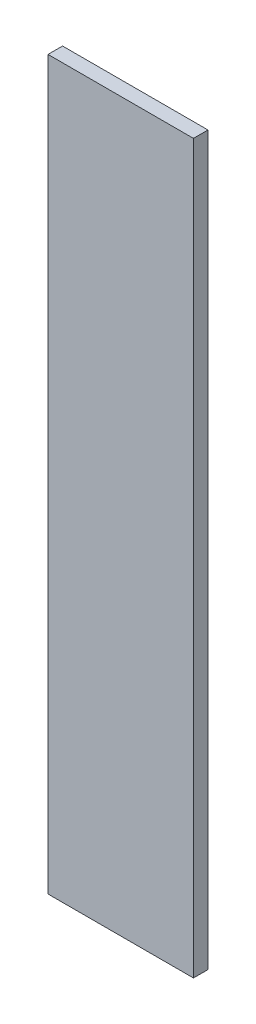
ISO-10303-21;
HEADER;
FILE_DESCRIPTION(('STEP AP214'),'2;1');
FILE_NAME('part.step','',(''),(''),'','','');
FILE_SCHEMA(('AUTOMOTIVE_DESIGN { 1 0 10303 214 1 1 1 1 }'));
ENDSEC;
DATA;
#1=APPLICATION_CONTEXT('core data for automotive mechanical design processes');
#2=APPLICATION_PROTOCOL_DEFINITION('international standard','automotive_design',2000,#1);
#3=PRODUCT_CONTEXT('',#1,'mechanical');
#4=PRODUCT('Part','Part','',(#3));
#5=PRODUCT_RELATED_PRODUCT_CATEGORY('part','',(#4));
#6=PRODUCT_DEFINITION_FORMATION('','',#4);
#7=PRODUCT_DEFINITION_CONTEXT('part definition',#1,'design');
#8=PRODUCT_DEFINITION('design','',#6,#7);
#9=PRODUCT_DEFINITION_SHAPE('','',#8);
#10=(LENGTH_UNIT() NAMED_UNIT(*) SI_UNIT(.MILLI.,.METRE.));
#11=(NAMED_UNIT(*) PLANE_ANGLE_UNIT() SI_UNIT($,.RADIAN.));
#12=(NAMED_UNIT(*) SI_UNIT($,.STERADIAN.) SOLID_ANGLE_UNIT());
#13=UNCERTAINTY_MEASURE_WITH_UNIT(LENGTH_MEASURE(1.E-05),#10,'distance_accuracy_value','');
#14=(GEOMETRIC_REPRESENTATION_CONTEXT(3) GLOBAL_UNCERTAINTY_ASSIGNED_CONTEXT((#13)) GLOBAL_UNIT_ASSIGNED_CONTEXT((#10,
#11,#12)) REPRESENTATION_CONTEXT('',''));
#15=CARTESIAN_POINT('',(0.,0.,0.));
#16=DIRECTION('',(0.,0.,1.));
#17=DIRECTION('',(1.,0.,0.));
#18=AXIS2_PLACEMENT_3D('',#15,#16,#17);
#19=CARTESIAN_POINT('',(9.99999999999999,50.,2.));
#20=DIRECTION('',(-1.,0.,0.));
#21=DIRECTION('',(0.,-1.,0.));
#22=AXIS2_PLACEMENT_3D('',#19,#20,#21);
#23=PLANE('',#22);
#24=DIRECTION('',(0.,1.,0.));
#25=VECTOR('',#24,1.);
#26=CARTESIAN_POINT('',(9.99999999999999,50.,0.));
#27=LINE('',#26,#25);
#28=CARTESIAN_POINT('',(10.,-50.,0.));
#29=VERTEX_POINT('',#28);
#30=CARTESIAN_POINT('',(9.99999999999999,50.,0.));
#31=VERTEX_POINT('',#30);
#32=EDGE_CURVE('E102',#29,#31,#27,.T.);
#33=ORIENTED_EDGE('',*,*,#32,.T.);
#34=DIRECTION('',(0.,0.,-1.));
#35=VECTOR('',#34,1.);
#36=CARTESIAN_POINT('',(9.99999999999999,50.,2.));
#37=LINE('',#36,#35);
#38=CARTESIAN_POINT('',(9.99999999999999,50.,2.));
#39=VERTEX_POINT('',#38);
#40=EDGE_CURVE('E11',#39,#31,#37,.T.);
#41=ORIENTED_EDGE('',*,*,#40,.F.);
#42=DIRECTION('',(0.,1.,0.));
#43=VECTOR('',#42,1.);
#44=CARTESIAN_POINT('',(9.99999999999999,50.,2.));
#45=LINE('',#44,#43);
#46=CARTESIAN_POINT('',(10.,-50.,2.));
#47=VERTEX_POINT('',#46);
#48=EDGE_CURVE('E90',#47,#39,#45,.T.);
#49=ORIENTED_EDGE('',*,*,#48,.F.);
#50=DIRECTION('',(0.,0.,-1.));
#51=VECTOR('',#50,1.);
#52=CARTESIAN_POINT('',(10.,-50.,2.));
#53=LINE('',#52,#51);
#54=EDGE_CURVE('E98',#47,#29,#53,.T.);
#55=ORIENTED_EDGE('',*,*,#54,.T.);
#56=EDGE_LOOP('',(#33,#41,#49,#55));
#57=FACE_BOUND('',#56,.T.);
#58=ADVANCED_FACE('F39',(#57),#23,.F.);
#59=CARTESIAN_POINT('',(-10.,50.,2.));
#60=DIRECTION('',(0.,-1.,0.));
#61=DIRECTION('',(0.,0.,-1.));
#62=AXIS2_PLACEMENT_3D('',#59,#60,#61);
#63=PLANE('',#62);
#64=DIRECTION('',(-1.,0.,0.));
#65=VECTOR('',#64,1.);
#66=CARTESIAN_POINT('',(-10.,50.,0.));
#67=LINE('',#66,#65);
#68=CARTESIAN_POINT('',(-10.,50.,0.));
#69=VERTEX_POINT('',#68);
#70=EDGE_CURVE('E94',#31,#69,#67,.T.);
#71=ORIENTED_EDGE('',*,*,#70,.T.);
#72=DIRECTION('',(0.,0.,-1.));
#73=VECTOR('',#72,1.);
#74=CARTESIAN_POINT('',(-10.,50.,2.));
#75=LINE('',#74,#73);
#76=CARTESIAN_POINT('',(-10.,50.,2.));
#77=VERTEX_POINT('',#76);
#78=EDGE_CURVE('E47',#77,#69,#75,.T.);
#79=ORIENTED_EDGE('',*,*,#78,.F.);
#80=DIRECTION('',(-1.,0.,0.));
#81=VECTOR('',#80,1.);
#82=CARTESIAN_POINT('',(-10.,50.,2.));
#83=LINE('',#82,#81);
#84=EDGE_CURVE('E85',#39,#77,#83,.T.);
#85=ORIENTED_EDGE('',*,*,#84,.F.);
#86=ORIENTED_EDGE('',*,*,#40,.T.);
#87=EDGE_LOOP('',(#71,#79,#85,#86));
#88=FACE_BOUND('',#87,.T.);
#89=ADVANCED_FACE('F93',(#88),#63,.F.);
#90=CARTESIAN_POINT('',(-10.,50.,2.));
#91=DIRECTION('',(1.,0.,0.));
#92=DIRECTION('',(0.,1.,0.));
#93=AXIS2_PLACEMENT_3D('',#90,#91,#92);
#94=PLANE('',#93);
#95=DIRECTION('',(0.,-1.,0.));
#96=VECTOR('',#95,1.);
#97=CARTESIAN_POINT('',(-10.,50.,0.));
#98=LINE('',#97,#96);
#99=CARTESIAN_POINT('',(-9.99999999999999,-50.,0.));
#100=VERTEX_POINT('',#99);
#101=EDGE_CURVE('E72',#69,#100,#98,.T.);
#102=ORIENTED_EDGE('',*,*,#101,.T.);
#103=DIRECTION('',(0.,0.,-1.));
#104=VECTOR('',#103,1.);
#105=CARTESIAN_POINT('',(-9.99999999999999,-50.,2.));
#106=LINE('',#105,#104);
#107=CARTESIAN_POINT('',(-9.99999999999999,-50.,2.));
#108=VERTEX_POINT('',#107);
#109=EDGE_CURVE('E95',#108,#100,#106,.T.);
#110=ORIENTED_EDGE('',*,*,#109,.F.);
#111=DIRECTION('',(0.,-1.,0.));
#112=VECTOR('',#111,1.);
#113=CARTESIAN_POINT('',(-10.,50.,2.));
#114=LINE('',#113,#112);
#115=EDGE_CURVE('E88',#77,#108,#114,.T.);
#116=ORIENTED_EDGE('',*,*,#115,.F.);
#117=ORIENTED_EDGE('',*,*,#78,.T.);
#118=EDGE_LOOP('',(#102,#110,#116,#117));
#119=FACE_BOUND('',#118,.T.);
#120=ADVANCED_FACE('F96',(#119),#94,.F.);
#121=CARTESIAN_POINT('',(-9.99999999999999,-50.,2.));
#122=DIRECTION('',(0.,1.,0.));
#123=DIRECTION('',(0.,0.,1.));
#124=AXIS2_PLACEMENT_3D('',#121,#122,#123);
#125=PLANE('',#124);
#126=DIRECTION('',(1.,0.,0.));
#127=VECTOR('',#126,1.);
#128=CARTESIAN_POINT('',(-9.99999999999999,-50.,0.));
#129=LINE('',#128,#127);
#130=EDGE_CURVE('E78',#100,#29,#129,.T.);
#131=ORIENTED_EDGE('',*,*,#130,.T.);
#132=ORIENTED_EDGE('',*,*,#54,.F.);
#133=DIRECTION('',(1.,0.,0.));
#134=VECTOR('',#133,1.);
#135=CARTESIAN_POINT('',(-9.99999999999999,-50.,2.));
#136=LINE('',#135,#134);
#137=EDGE_CURVE('E55',#108,#47,#136,.T.);
#138=ORIENTED_EDGE('',*,*,#137,.F.);
#139=ORIENTED_EDGE('',*,*,#109,.T.);
#140=EDGE_LOOP('',(#131,#132,#138,#139));
#141=FACE_BOUND('',#140,.T.);
#142=ADVANCED_FACE('F109',(#141),#125,.F.);
#143=CARTESIAN_POINT('',(0.,0.,2.));
#144=DIRECTION('',(0.,0.,1.));
#145=DIRECTION('',(1.,0.,0.));
#146=AXIS2_PLACEMENT_3D('',#143,#144,#145);
#147=PLANE('',#146);
#148=ORIENTED_EDGE('',*,*,#48,.T.);
#149=ORIENTED_EDGE('',*,*,#84,.T.);
#150=ORIENTED_EDGE('',*,*,#115,.T.);
#151=ORIENTED_EDGE('',*,*,#137,.T.);
#152=EDGE_LOOP('',(#148,#149,#150,#151));
#153=FACE_BOUND('',#152,.T.);
#154=ADVANCED_FACE('F86',(#153),#147,.T.);
#155=CARTESIAN_POINT('',(0.,0.,0.));
#156=DIRECTION('',(0.,0.,1.));
#157=DIRECTION('',(1.,0.,0.));
#158=AXIS2_PLACEMENT_3D('',#155,#156,#157);
#159=PLANE('',#158);
#160=ORIENTED_EDGE('',*,*,#32,.F.);
#161=ORIENTED_EDGE('',*,*,#130,.F.);
#162=ORIENTED_EDGE('',*,*,#101,.F.);
#163=ORIENTED_EDGE('',*,*,#70,.F.);
#164=EDGE_LOOP('',(#160,#161,#162,#163));
#165=FACE_BOUND('',#164,.T.);
#166=ADVANCED_FACE('F112',(#165),#159,.F.);
#167=CLOSED_SHELL('',(#58,#89,#120,#142,#154,#166));
#168=MANIFOLD_SOLID_BREP('B2',#167);
#169=ADVANCED_BREP_SHAPE_REPRESENTATION('',(#18,#168),#14);
#170=SHAPE_DEFINITION_REPRESENTATION(#9,#169);
ENDSEC;
END-ISO-10303-21;
